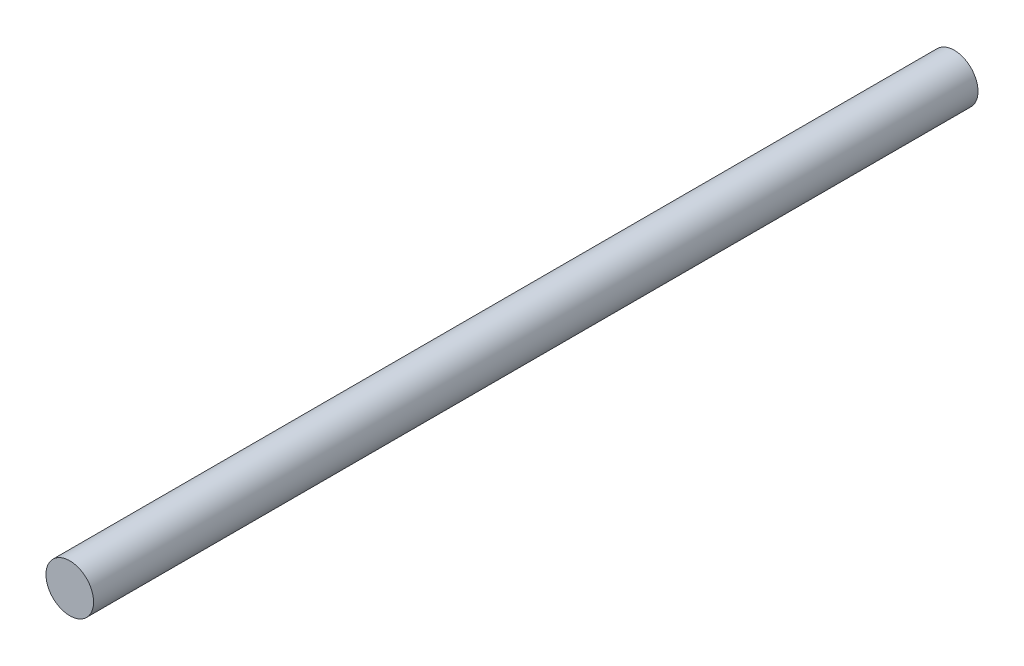
ISO-10303-21;
HEADER;
FILE_DESCRIPTION(('STEP AP214'),'2;1');
FILE_NAME('part.step','',(''),(''),'','','');
FILE_SCHEMA(('AUTOMOTIVE_DESIGN { 1 0 10303 214 1 1 1 1 }'));
ENDSEC;
DATA;
#1=APPLICATION_CONTEXT('core data for automotive mechanical design processes');
#2=APPLICATION_PROTOCOL_DEFINITION('international standard','automotive_design',2000,#1);
#3=PRODUCT_CONTEXT('',#1,'mechanical');
#4=PRODUCT('Part','Part','',(#3));
#5=PRODUCT_RELATED_PRODUCT_CATEGORY('part','',(#4));
#6=PRODUCT_DEFINITION_FORMATION('','',#4);
#7=PRODUCT_DEFINITION_CONTEXT('part definition',#1,'design');
#8=PRODUCT_DEFINITION('design','',#6,#7);
#9=PRODUCT_DEFINITION_SHAPE('','',#8);
#10=(LENGTH_UNIT() NAMED_UNIT(*) SI_UNIT(.MILLI.,.METRE.));
#11=(NAMED_UNIT(*) PLANE_ANGLE_UNIT() SI_UNIT($,.RADIAN.));
#12=(NAMED_UNIT(*) SI_UNIT($,.STERADIAN.) SOLID_ANGLE_UNIT());
#13=UNCERTAINTY_MEASURE_WITH_UNIT(LENGTH_MEASURE(1.E-05),#10,'distance_accuracy_value','');
#14=(GEOMETRIC_REPRESENTATION_CONTEXT(3) GLOBAL_UNCERTAINTY_ASSIGNED_CONTEXT((#13)) GLOBAL_UNIT_ASSIGNED_CONTEXT((#10,
#11,#12)) REPRESENTATION_CONTEXT('',''));
#15=CARTESIAN_POINT('',(0.,0.,0.));
#16=DIRECTION('',(0.,0.,1.));
#17=DIRECTION('',(1.,0.,0.));
#18=AXIS2_PLACEMENT_3D('',#15,#16,#17);
#19=CARTESIAN_POINT('',(0.,0.,148.5));
#20=DIRECTION('',(0.,0.,-1.));
#21=DIRECTION('',(-1.,0.,0.));
#22=AXIS2_PLACEMENT_3D('',#19,#20,#21);
#23=CYLINDRICAL_SURFACE('',#22,4.);
#24=CARTESIAN_POINT('',(0.,0.,148.5));
#25=DIRECTION('',(0.,0.,1.));
#26=DIRECTION('',(1.,0.,0.));
#27=AXIS2_PLACEMENT_3D('',#24,#25,#26);
#28=CIRCLE('',#27,4.);
#29=CARTESIAN_POINT('',(4.,0.,148.5));
#30=VERTEX_POINT('',#29);
#31=EDGE_CURVE('E10',#30,#30,#28,.T.);
#32=ORIENTED_EDGE('',*,*,#31,.F.);
#33=EDGE_LOOP('',(#32));
#34=FACE_BOUND('',#33,.T.);
#35=CARTESIAN_POINT('',(0.,0.,0.));
#36=DIRECTION('',(0.,0.,1.));
#37=DIRECTION('',(1.,0.,0.));
#38=AXIS2_PLACEMENT_3D('',#35,#36,#37);
#39=CIRCLE('',#38,4.);
#40=CARTESIAN_POINT('',(4.,0.,0.));
#41=VERTEX_POINT('',#40);
#42=EDGE_CURVE('E34',#41,#41,#39,.T.);
#43=ORIENTED_EDGE('',*,*,#42,.T.);
#44=EDGE_LOOP('',(#43));
#45=FACE_BOUND('',#44,.T.);
#46=ADVANCED_FACE('F31',(#34,#45),#23,.T.);
#47=CARTESIAN_POINT('',(0.,0.,148.5));
#48=DIRECTION('',(0.,0.,1.));
#49=DIRECTION('',(1.,0.,0.));
#50=AXIS2_PLACEMENT_3D('',#47,#48,#49);
#51=PLANE('',#50);
#52=ORIENTED_EDGE('',*,*,#31,.T.);
#53=EDGE_LOOP('',(#52));
#54=FACE_BOUND('',#53,.T.);
#55=ADVANCED_FACE('F46',(#54),#51,.T.);
#56=CARTESIAN_POINT('',(0.,0.,0.));
#57=DIRECTION('',(0.,0.,1.));
#58=DIRECTION('',(1.,0.,0.));
#59=AXIS2_PLACEMENT_3D('',#56,#57,#58);
#60=PLANE('',#59);
#61=ORIENTED_EDGE('',*,*,#42,.F.);
#62=EDGE_LOOP('',(#61));
#63=FACE_BOUND('',#62,.T.);
#64=ADVANCED_FACE('F44',(#63),#60,.F.);
#65=CLOSED_SHELL('',(#46,#55,#64));
#66=MANIFOLD_SOLID_BREP('B2',#65);
#67=ADVANCED_BREP_SHAPE_REPRESENTATION('',(#18,#66),#14);
#68=SHAPE_DEFINITION_REPRESENTATION(#9,#67);
ENDSEC;
END-ISO-10303-21;
